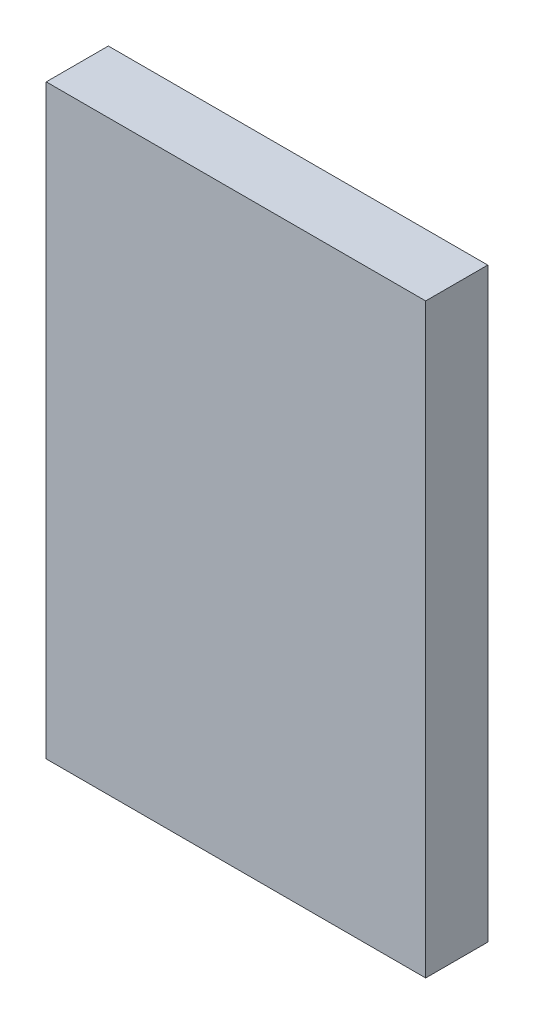
ISO-10303-21;
HEADER;
FILE_DESCRIPTION(('STEP AP214'),'2;1');
FILE_NAME('part.step','',(''),(''),'','','');
FILE_SCHEMA(('AUTOMOTIVE_DESIGN { 1 0 10303 214 1 1 1 1 }'));
ENDSEC;
DATA;
#1=APPLICATION_CONTEXT('core data for automotive mechanical design processes');
#2=APPLICATION_PROTOCOL_DEFINITION('international standard','automotive_design',2000,#1);
#3=PRODUCT_CONTEXT('',#1,'mechanical');
#4=PRODUCT('Part','Part','',(#3));
#5=PRODUCT_RELATED_PRODUCT_CATEGORY('part','',(#4));
#6=PRODUCT_DEFINITION_FORMATION('','',#4);
#7=PRODUCT_DEFINITION_CONTEXT('part definition',#1,'design');
#8=PRODUCT_DEFINITION('design','',#6,#7);
#9=PRODUCT_DEFINITION_SHAPE('','',#8);
#10=(LENGTH_UNIT() NAMED_UNIT(*) SI_UNIT(.MILLI.,.METRE.));
#11=(NAMED_UNIT(*) PLANE_ANGLE_UNIT() SI_UNIT($,.RADIAN.));
#12=(NAMED_UNIT(*) SI_UNIT($,.STERADIAN.) SOLID_ANGLE_UNIT());
#13=UNCERTAINTY_MEASURE_WITH_UNIT(LENGTH_MEASURE(1.E-05),#10,'distance_accuracy_value','');
#14=(GEOMETRIC_REPRESENTATION_CONTEXT(3) GLOBAL_UNCERTAINTY_ASSIGNED_CONTEXT((#13)) GLOBAL_UNIT_ASSIGNED_CONTEXT((#10,
#11,#12)) REPRESENTATION_CONTEXT('',''));
#15=CARTESIAN_POINT('',(0.,0.,0.));
#16=DIRECTION('',(0.,0.,1.));
#17=DIRECTION('',(1.,0.,0.));
#18=AXIS2_PLACEMENT_3D('',#15,#16,#17);
#19=CARTESIAN_POINT('',(27.5,-42.5,9.));
#20=DIRECTION('',(-1.,0.,0.));
#21=DIRECTION('',(0.,0.,1.));
#22=AXIS2_PLACEMENT_3D('',#19,#20,#21);
#23=PLANE('',#22);
#24=DIRECTION('',(0.,1.,0.));
#25=VECTOR('',#24,1.);
#26=CARTESIAN_POINT('',(27.5,-42.5,0.));
#27=LINE('',#26,#25);
#28=CARTESIAN_POINT('',(27.5,-42.5,0.));
#29=VERTEX_POINT('',#28);
#30=CARTESIAN_POINT('',(27.5,42.5,0.));
#31=VERTEX_POINT('',#30);
#32=EDGE_CURVE('E95',#29,#31,#27,.T.);
#33=ORIENTED_EDGE('',*,*,#32,.T.);
#34=DIRECTION('',(0.,0.,-1.));
#35=VECTOR('',#34,1.);
#36=CARTESIAN_POINT('',(27.5,42.5,9.));
#37=LINE('',#36,#35);
#38=CARTESIAN_POINT('',(27.5,42.5,9.));
#39=VERTEX_POINT('',#38);
#40=EDGE_CURVE('E11',#39,#31,#37,.T.);
#41=ORIENTED_EDGE('',*,*,#40,.F.);
#42=DIRECTION('',(0.,1.,0.));
#43=VECTOR('',#42,1.);
#44=CARTESIAN_POINT('',(27.5,-42.5,9.));
#45=LINE('',#44,#43);
#46=CARTESIAN_POINT('',(27.5,-42.5,9.));
#47=VERTEX_POINT('',#46);
#48=EDGE_CURVE('E83',#47,#39,#45,.T.);
#49=ORIENTED_EDGE('',*,*,#48,.F.);
#50=DIRECTION('',(0.,0.,-1.));
#51=VECTOR('',#50,1.);
#52=CARTESIAN_POINT('',(27.5,-42.5,9.));
#53=LINE('',#52,#51);
#54=EDGE_CURVE('E91',#47,#29,#53,.T.);
#55=ORIENTED_EDGE('',*,*,#54,.T.);
#56=EDGE_LOOP('',(#33,#41,#49,#55));
#57=FACE_BOUND('',#56,.T.);
#58=ADVANCED_FACE('F32',(#57),#23,.F.);
#59=CARTESIAN_POINT('',(-27.5,42.5,9.));
#60=DIRECTION('',(0.,-1.,0.));
#61=DIRECTION('',(0.,0.,-1.));
#62=AXIS2_PLACEMENT_3D('',#59,#60,#61);
#63=PLANE('',#62);
#64=DIRECTION('',(-1.,0.,0.));
#65=VECTOR('',#64,1.);
#66=CARTESIAN_POINT('',(-27.5,42.5,0.));
#67=LINE('',#66,#65);
#68=CARTESIAN_POINT('',(-27.5,42.5,0.));
#69=VERTEX_POINT('',#68);
#70=EDGE_CURVE('E87',#31,#69,#67,.T.);
#71=ORIENTED_EDGE('',*,*,#70,.T.);
#72=DIRECTION('',(0.,0.,-1.));
#73=VECTOR('',#72,1.);
#74=CARTESIAN_POINT('',(-27.5,42.5,9.));
#75=LINE('',#74,#73);
#76=CARTESIAN_POINT('',(-27.5,42.5,9.));
#77=VERTEX_POINT('',#76);
#78=EDGE_CURVE('E40',#77,#69,#75,.T.);
#79=ORIENTED_EDGE('',*,*,#78,.F.);
#80=DIRECTION('',(-1.,0.,0.));
#81=VECTOR('',#80,1.);
#82=CARTESIAN_POINT('',(-27.5,42.5,9.));
#83=LINE('',#82,#81);
#84=EDGE_CURVE('E78',#39,#77,#83,.T.);
#85=ORIENTED_EDGE('',*,*,#84,.F.);
#86=ORIENTED_EDGE('',*,*,#40,.T.);
#87=EDGE_LOOP('',(#71,#79,#85,#86));
#88=FACE_BOUND('',#87,.T.);
#89=ADVANCED_FACE('F86',(#88),#63,.F.);
#90=CARTESIAN_POINT('',(-27.5,-42.5,9.));
#91=DIRECTION('',(1.,0.,0.));
#92=DIRECTION('',(0.,0.,-1.));
#93=AXIS2_PLACEMENT_3D('',#90,#91,#92);
#94=PLANE('',#93);
#95=DIRECTION('',(0.,-1.,0.));
#96=VECTOR('',#95,1.);
#97=CARTESIAN_POINT('',(-27.5,-42.5,0.));
#98=LINE('',#97,#96);
#99=CARTESIAN_POINT('',(-27.5,-42.5,0.));
#100=VERTEX_POINT('',#99);
#101=EDGE_CURVE('E65',#69,#100,#98,.T.);
#102=ORIENTED_EDGE('',*,*,#101,.T.);
#103=DIRECTION('',(0.,0.,-1.));
#104=VECTOR('',#103,1.);
#105=CARTESIAN_POINT('',(-27.5,-42.5,9.));
#106=LINE('',#105,#104);
#107=CARTESIAN_POINT('',(-27.5,-42.5,9.));
#108=VERTEX_POINT('',#107);
#109=EDGE_CURVE('E88',#108,#100,#106,.T.);
#110=ORIENTED_EDGE('',*,*,#109,.F.);
#111=DIRECTION('',(0.,-1.,0.));
#112=VECTOR('',#111,1.);
#113=CARTESIAN_POINT('',(-27.5,-42.5,9.));
#114=LINE('',#113,#112);
#115=EDGE_CURVE('E81',#77,#108,#114,.T.);
#116=ORIENTED_EDGE('',*,*,#115,.F.);
#117=ORIENTED_EDGE('',*,*,#78,.T.);
#118=EDGE_LOOP('',(#102,#110,#116,#117));
#119=FACE_BOUND('',#118,.T.);
#120=ADVANCED_FACE('F89',(#119),#94,.F.);
#121=CARTESIAN_POINT('',(-27.5,-42.5,9.));
#122=DIRECTION('',(0.,1.,0.));
#123=DIRECTION('',(0.,0.,1.));
#124=AXIS2_PLACEMENT_3D('',#121,#122,#123);
#125=PLANE('',#124);
#126=DIRECTION('',(1.,0.,0.));
#127=VECTOR('',#126,1.);
#128=CARTESIAN_POINT('',(-27.5,-42.5,0.));
#129=LINE('',#128,#127);
#130=EDGE_CURVE('E71',#100,#29,#129,.T.);
#131=ORIENTED_EDGE('',*,*,#130,.T.);
#132=ORIENTED_EDGE('',*,*,#54,.F.);
#133=DIRECTION('',(1.,0.,0.));
#134=VECTOR('',#133,1.);
#135=CARTESIAN_POINT('',(-27.5,-42.5,9.));
#136=LINE('',#135,#134);
#137=EDGE_CURVE('E48',#108,#47,#136,.T.);
#138=ORIENTED_EDGE('',*,*,#137,.F.);
#139=ORIENTED_EDGE('',*,*,#109,.T.);
#140=EDGE_LOOP('',(#131,#132,#138,#139));
#141=FACE_BOUND('',#140,.T.);
#142=ADVANCED_FACE('F102',(#141),#125,.F.);
#143=CARTESIAN_POINT('',(0.,0.,9.));
#144=DIRECTION('',(0.,0.,-1.));
#145=DIRECTION('',(-1.,0.,0.));
#146=AXIS2_PLACEMENT_3D('',#143,#144,#145);
#147=PLANE('',#146);
#148=ORIENTED_EDGE('',*,*,#48,.T.);
#149=ORIENTED_EDGE('',*,*,#84,.T.);
#150=ORIENTED_EDGE('',*,*,#115,.T.);
#151=ORIENTED_EDGE('',*,*,#137,.T.);
#152=EDGE_LOOP('',(#148,#149,#150,#151));
#153=FACE_BOUND('',#152,.T.);
#154=ADVANCED_FACE('F79',(#153),#147,.F.);
#155=CARTESIAN_POINT('',(0.,0.,0.));
#156=DIRECTION('',(0.,0.,-1.));
#157=DIRECTION('',(-1.,0.,0.));
#158=AXIS2_PLACEMENT_3D('',#155,#156,#157);
#159=PLANE('',#158);
#160=ORIENTED_EDGE('',*,*,#32,.F.);
#161=ORIENTED_EDGE('',*,*,#130,.F.);
#162=ORIENTED_EDGE('',*,*,#101,.F.);
#163=ORIENTED_EDGE('',*,*,#70,.F.);
#164=EDGE_LOOP('',(#160,#161,#162,#163));
#165=FACE_BOUND('',#164,.T.);
#166=ADVANCED_FACE('F105',(#165),#159,.T.);
#167=CLOSED_SHELL('',(#58,#89,#120,#142,#154,#166));
#168=MANIFOLD_SOLID_BREP('B2',#167);
#169=ADVANCED_BREP_SHAPE_REPRESENTATION('',(#18,#168),#14);
#170=SHAPE_DEFINITION_REPRESENTATION(#9,#169);
ENDSEC;
END-ISO-10303-21;
